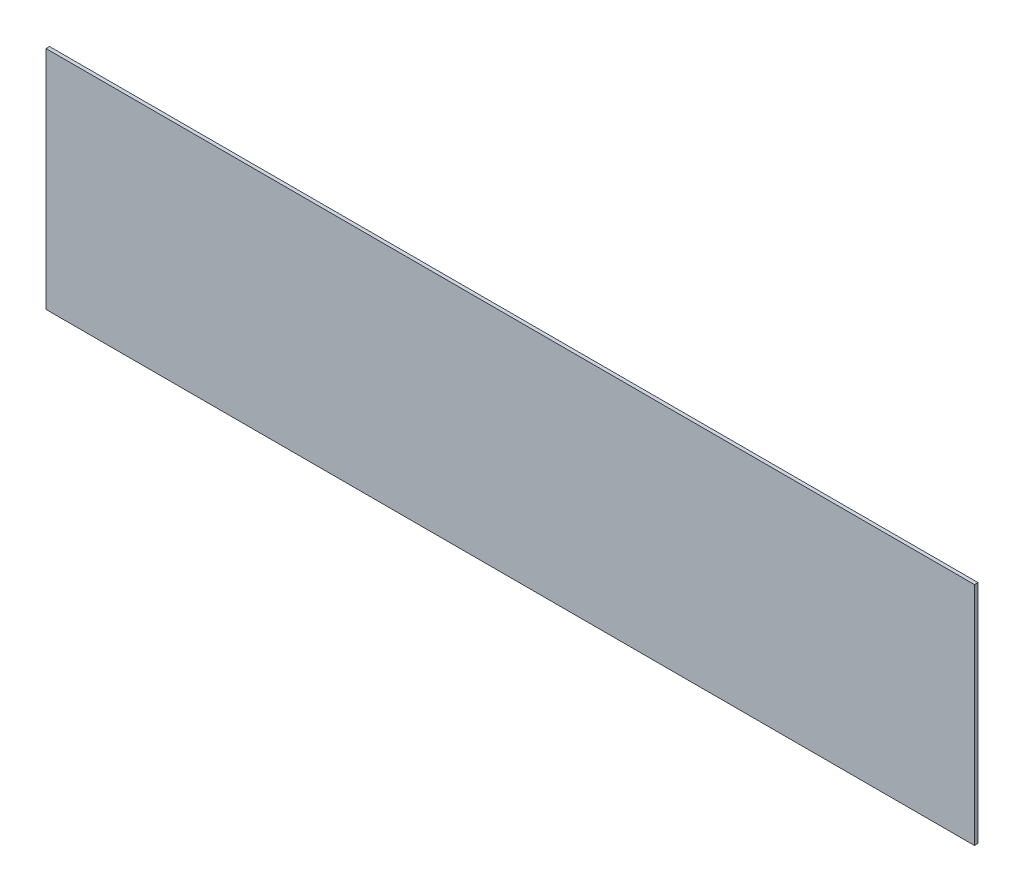
ISO-10303-21;
HEADER;
FILE_DESCRIPTION(('STEP AP214'),'2;1');
FILE_NAME('part.step','',(''),(''),'','','');
FILE_SCHEMA(('AUTOMOTIVE_DESIGN { 1 0 10303 214 1 1 1 1 }'));
ENDSEC;
DATA;
#1=APPLICATION_CONTEXT('core data for automotive mechanical design processes');
#2=APPLICATION_PROTOCOL_DEFINITION('international standard','automotive_design',2000,#1);
#3=PRODUCT_CONTEXT('',#1,'mechanical');
#4=PRODUCT('Part','Part','',(#3));
#5=PRODUCT_RELATED_PRODUCT_CATEGORY('part','',(#4));
#6=PRODUCT_DEFINITION_FORMATION('','',#4);
#7=PRODUCT_DEFINITION_CONTEXT('part definition',#1,'design');
#8=PRODUCT_DEFINITION('design','',#6,#7);
#9=PRODUCT_DEFINITION_SHAPE('','',#8);
#10=(LENGTH_UNIT() NAMED_UNIT(*) SI_UNIT(.MILLI.,.METRE.));
#11=(NAMED_UNIT(*) PLANE_ANGLE_UNIT() SI_UNIT($,.RADIAN.));
#12=(NAMED_UNIT(*) SI_UNIT($,.STERADIAN.) SOLID_ANGLE_UNIT());
#13=UNCERTAINTY_MEASURE_WITH_UNIT(LENGTH_MEASURE(1.E-05),#10,'distance_accuracy_value','');
#14=(GEOMETRIC_REPRESENTATION_CONTEXT(3) GLOBAL_UNCERTAINTY_ASSIGNED_CONTEXT((#13)) GLOBAL_UNIT_ASSIGNED_CONTEXT((#10,
#11,#12)) REPRESENTATION_CONTEXT('',''));
#15=CARTESIAN_POINT('',(0.,0.,0.));
#16=DIRECTION('',(0.,0.,1.));
#17=DIRECTION('',(1.,0.,0.));
#18=AXIS2_PLACEMENT_3D('',#15,#16,#17);
#19=CARTESIAN_POINT('',(0.,0.,0.));
#20=DIRECTION('',(0.,0.,1.));
#21=DIRECTION('',(1.,0.,0.));
#22=AXIS2_PLACEMENT_3D('',#19,#20,#21);
#23=PLANE('',#22);
#24=DIRECTION('',(-1.,0.,0.));
#25=VECTOR('',#24,1.);
#26=CARTESIAN_POINT('',(0.,-64.25,0.));
#27=LINE('',#26,#25);
#28=CARTESIAN_POINT('',(264.,-64.25,0.));
#29=VERTEX_POINT('',#28);
#30=CARTESIAN_POINT('',(-264.,-64.25,0.));
#31=VERTEX_POINT('',#30);
#32=EDGE_CURVE('E11',#29,#31,#27,.T.);
#33=ORIENTED_EDGE('',*,*,#32,.F.);
#34=DIRECTION('',(0.,-1.,0.));
#35=VECTOR('',#34,1.);
#36=CARTESIAN_POINT('',(264.,0.,0.));
#37=LINE('',#36,#35);
#38=CARTESIAN_POINT('',(264.,64.25,0.));
#39=VERTEX_POINT('',#38);
#40=EDGE_CURVE('E62',#39,#29,#37,.T.);
#41=ORIENTED_EDGE('',*,*,#40,.F.);
#42=DIRECTION('',(1.,0.,0.));
#43=VECTOR('',#42,1.);
#44=CARTESIAN_POINT('',(0.,64.25,0.));
#45=LINE('',#44,#43);
#46=CARTESIAN_POINT('',(-264.,64.25,0.));
#47=VERTEX_POINT('',#46);
#48=EDGE_CURVE('E98',#47,#39,#45,.T.);
#49=ORIENTED_EDGE('',*,*,#48,.F.);
#50=DIRECTION('',(0.,1.,0.));
#51=VECTOR('',#50,1.);
#52=CARTESIAN_POINT('',(-264.,0.,0.));
#53=LINE('',#52,#51);
#54=EDGE_CURVE('E25',#31,#47,#53,.T.);
#55=ORIENTED_EDGE('',*,*,#54,.F.);
#56=EDGE_LOOP('',(#33,#41,#49,#55));
#57=FACE_BOUND('',#56,.T.);
#58=ADVANCED_FACE('F17',(#57),#23,.T.);
#59=CARTESIAN_POINT('',(0.,-64.25,-2.));
#60=DIRECTION('',(0.,-1.,0.));
#61=DIRECTION('',(0.,0.,-1.));
#62=AXIS2_PLACEMENT_3D('',#59,#60,#61);
#63=PLANE('',#62);
#64=DIRECTION('',(0.,0.,1.));
#65=VECTOR('',#64,1.);
#66=CARTESIAN_POINT('',(264.,-64.25,-2.));
#67=LINE('',#66,#65);
#68=CARTESIAN_POINT('',(264.,-64.25,-2.));
#69=VERTEX_POINT('',#68);
#70=EDGE_CURVE('E55',#69,#29,#67,.T.);
#71=ORIENTED_EDGE('',*,*,#70,.T.);
#72=ORIENTED_EDGE('',*,*,#32,.T.);
#73=DIRECTION('',(0.,0.,1.));
#74=VECTOR('',#73,1.);
#75=CARTESIAN_POINT('',(-264.,-64.25,-2.));
#76=LINE('',#75,#74);
#77=CARTESIAN_POINT('',(-264.,-64.25,-2.));
#78=VERTEX_POINT('',#77);
#79=EDGE_CURVE('E69',#78,#31,#76,.T.);
#80=ORIENTED_EDGE('',*,*,#79,.F.);
#81=DIRECTION('',(1.,0.,0.));
#82=VECTOR('',#81,1.);
#83=CARTESIAN_POINT('',(0.,-64.25,-2.));
#84=LINE('',#83,#82);
#85=EDGE_CURVE('E67',#78,#69,#84,.T.);
#86=ORIENTED_EDGE('',*,*,#85,.T.);
#87=EDGE_LOOP('',(#71,#72,#80,#86));
#88=FACE_BOUND('',#87,.T.);
#89=ADVANCED_FACE('F68',(#88),#63,.T.);
#90=CARTESIAN_POINT('',(-264.,0.,-2.));
#91=DIRECTION('',(-1.,0.,0.));
#92=DIRECTION('',(0.,0.,1.));
#93=AXIS2_PLACEMENT_3D('',#90,#91,#92);
#94=PLANE('',#93);
#95=ORIENTED_EDGE('',*,*,#79,.T.);
#96=ORIENTED_EDGE('',*,*,#54,.T.);
#97=DIRECTION('',(0.,0.,1.));
#98=VECTOR('',#97,1.);
#99=CARTESIAN_POINT('',(-264.,64.25,-2.));
#100=LINE('',#99,#98);
#101=CARTESIAN_POINT('',(-264.,64.25,-2.));
#102=VERTEX_POINT('',#101);
#103=EDGE_CURVE('E91',#102,#47,#100,.T.);
#104=ORIENTED_EDGE('',*,*,#103,.F.);
#105=DIRECTION('',(0.,-1.,0.));
#106=VECTOR('',#105,1.);
#107=CARTESIAN_POINT('',(-264.,0.,-2.));
#108=LINE('',#107,#106);
#109=EDGE_CURVE('E74',#102,#78,#108,.T.);
#110=ORIENTED_EDGE('',*,*,#109,.T.);
#111=EDGE_LOOP('',(#95,#96,#104,#110));
#112=FACE_BOUND('',#111,.T.);
#113=ADVANCED_FACE('F106',(#112),#94,.T.);
#114=CARTESIAN_POINT('',(0.,64.25,-2.));
#115=DIRECTION('',(0.,1.,0.));
#116=DIRECTION('',(0.,0.,1.));
#117=AXIS2_PLACEMENT_3D('',#114,#115,#116);
#118=PLANE('',#117);
#119=ORIENTED_EDGE('',*,*,#103,.T.);
#120=ORIENTED_EDGE('',*,*,#48,.T.);
#121=DIRECTION('',(0.,0.,1.));
#122=VECTOR('',#121,1.);
#123=CARTESIAN_POINT('',(264.,64.25,-2.));
#124=LINE('',#123,#122);
#125=CARTESIAN_POINT('',(264.,64.25,-2.));
#126=VERTEX_POINT('',#125);
#127=EDGE_CURVE('E64',#126,#39,#124,.T.);
#128=ORIENTED_EDGE('',*,*,#127,.F.);
#129=DIRECTION('',(-1.,0.,0.));
#130=VECTOR('',#129,1.);
#131=CARTESIAN_POINT('',(0.,64.25,-2.));
#132=LINE('',#131,#130);
#133=EDGE_CURVE('E79',#126,#102,#132,.T.);
#134=ORIENTED_EDGE('',*,*,#133,.T.);
#135=EDGE_LOOP('',(#119,#120,#128,#134));
#136=FACE_BOUND('',#135,.T.);
#137=ADVANCED_FACE('F104',(#136),#118,.T.);
#138=CARTESIAN_POINT('',(0.,0.,-2.));
#139=DIRECTION('',(0.,0.,-1.));
#140=DIRECTION('',(-1.,0.,0.));
#141=AXIS2_PLACEMENT_3D('',#138,#139,#140);
#142=PLANE('',#141);
#143=DIRECTION('',(0.,1.,0.));
#144=VECTOR('',#143,1.);
#145=CARTESIAN_POINT('',(264.,0.,-2.));
#146=LINE('',#145,#144);
#147=EDGE_CURVE('E60',#69,#126,#146,.T.);
#148=ORIENTED_EDGE('',*,*,#147,.F.);
#149=ORIENTED_EDGE('',*,*,#85,.F.);
#150=ORIENTED_EDGE('',*,*,#109,.F.);
#151=ORIENTED_EDGE('',*,*,#133,.F.);
#152=EDGE_LOOP('',(#148,#149,#150,#151));
#153=FACE_BOUND('',#152,.T.);
#154=ADVANCED_FACE('F77',(#153),#142,.T.);
#155=CARTESIAN_POINT('',(264.,0.,-2.));
#156=DIRECTION('',(1.,0.,0.));
#157=DIRECTION('',(0.,0.,-1.));
#158=AXIS2_PLACEMENT_3D('',#155,#156,#157);
#159=PLANE('',#158);
#160=ORIENTED_EDGE('',*,*,#147,.T.);
#161=ORIENTED_EDGE('',*,*,#127,.T.);
#162=ORIENTED_EDGE('',*,*,#40,.T.);
#163=ORIENTED_EDGE('',*,*,#70,.F.);
#164=EDGE_LOOP('',(#160,#161,#162,#163));
#165=FACE_BOUND('',#164,.T.);
#166=ADVANCED_FACE('F57',(#165),#159,.T.);
#167=CLOSED_SHELL('',(#58,#89,#113,#137,#154,#166));
#168=MANIFOLD_SOLID_BREP('B1',#167);
#169=ADVANCED_BREP_SHAPE_REPRESENTATION('',(#18,#168),#14);
#170=SHAPE_DEFINITION_REPRESENTATION(#9,#169);
ENDSEC;
END-ISO-10303-21;
